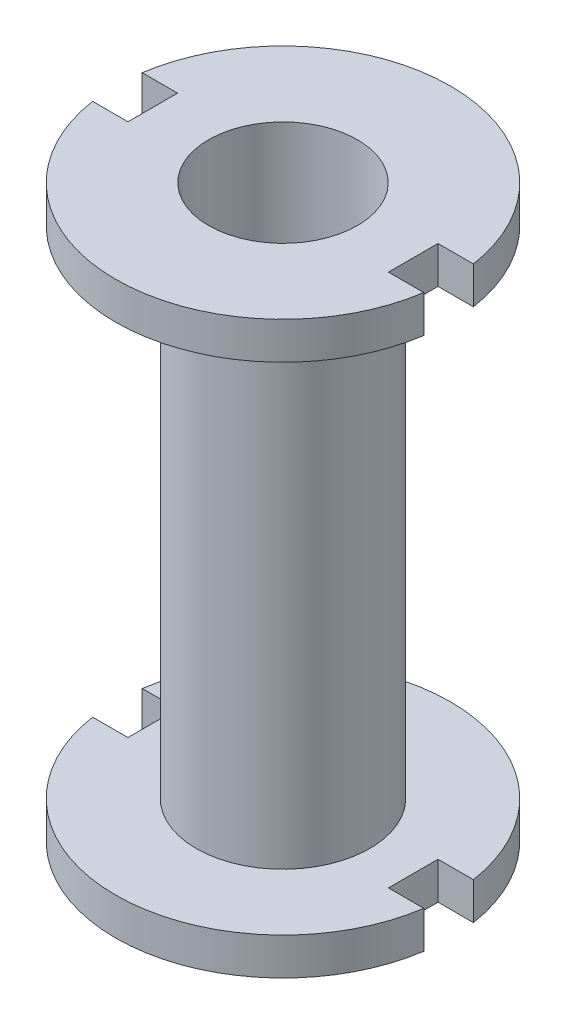
ISO-10303-21;
HEADER;
FILE_DESCRIPTION(('STEP AP214'),'2;1');
FILE_NAME('part.step','',(''),(''),'','','');
FILE_SCHEMA(('AUTOMOTIVE_DESIGN { 1 0 10303 214 1 1 1 1 }'));
ENDSEC;
DATA;
#1=APPLICATION_CONTEXT('core data for automotive mechanical design processes');
#2=APPLICATION_PROTOCOL_DEFINITION('international standard','automotive_design',2000,#1);
#3=PRODUCT_CONTEXT('',#1,'mechanical');
#4=PRODUCT('Part','Part','',(#3));
#5=PRODUCT_RELATED_PRODUCT_CATEGORY('part','',(#4));
#6=PRODUCT_DEFINITION_FORMATION('','',#4);
#7=PRODUCT_DEFINITION_CONTEXT('part definition',#1,'design');
#8=PRODUCT_DEFINITION('design','',#6,#7);
#9=PRODUCT_DEFINITION_SHAPE('','',#8);
#10=(LENGTH_UNIT() NAMED_UNIT(*) SI_UNIT(.MILLI.,.METRE.));
#11=(NAMED_UNIT(*) PLANE_ANGLE_UNIT() SI_UNIT($,.RADIAN.));
#12=(NAMED_UNIT(*) SI_UNIT($,.STERADIAN.) SOLID_ANGLE_UNIT());
#13=UNCERTAINTY_MEASURE_WITH_UNIT(LENGTH_MEASURE(1.E-05),#10,'distance_accuracy_value','');
#14=(GEOMETRIC_REPRESENTATION_CONTEXT(3) GLOBAL_UNCERTAINTY_ASSIGNED_CONTEXT((#13)) GLOBAL_UNIT_ASSIGNED_CONTEXT((#10,
#11,#12)) REPRESENTATION_CONTEXT('',''));
#15=CARTESIAN_POINT('',(0.,0.,0.));
#16=DIRECTION('',(0.,0.,1.));
#17=DIRECTION('',(1.,0.,0.));
#18=AXIS2_PLACEMENT_3D('',#15,#16,#17);
#19=CARTESIAN_POINT('',(0.,11.5,0.));
#20=DIRECTION('',(0.,-1.,0.));
#21=DIRECTION('',(0.,0.,-1.));
#22=AXIS2_PLACEMENT_3D('',#19,#20,#21);
#23=CYLINDRICAL_SURFACE('',#22,6.75);
#24=CARTESIAN_POINT('',(0.,-10.,0.));
#25=DIRECTION('',(0.,1.,0.));
#26=DIRECTION('',(0.,0.,1.));
#27=AXIS2_PLACEMENT_3D('',#24,#25,#26);
#28=CIRCLE('',#27,6.75);
#29=CARTESIAN_POINT('',(-6.67551496140934,-10.,1.));
#30=VERTEX_POINT('',#29);
#31=CARTESIAN_POINT('',(6.67551496140934,-10.,1.));
#32=VERTEX_POINT('',#31);
#33=EDGE_CURVE('E264',#30,#32,#28,.T.);
#34=ORIENTED_EDGE('',*,*,#33,.F.);
#35=DIRECTION('',(0.,-1.,0.));
#36=VECTOR('',#35,1.);
#37=CARTESIAN_POINT('',(-6.67551496140934,11.5,1.));
#38=LINE('',#37,#36);
#39=CARTESIAN_POINT('',(-6.67551496140934,-11.5,1.));
#40=VERTEX_POINT('',#39);
#41=EDGE_CURVE('E235',#30,#40,#38,.T.);
#42=ORIENTED_EDGE('',*,*,#41,.T.);
#43=CARTESIAN_POINT('',(0.,-11.5,0.));
#44=DIRECTION('',(0.,1.,0.));
#45=DIRECTION('',(0.,0.,1.));
#46=AXIS2_PLACEMENT_3D('',#43,#44,#45);
#47=CIRCLE('',#46,6.75);
#48=CARTESIAN_POINT('',(6.67551496140934,-11.5,1.));
#49=VERTEX_POINT('',#48);
#50=EDGE_CURVE('E249',#40,#49,#47,.T.);
#51=ORIENTED_EDGE('',*,*,#50,.T.);
#52=DIRECTION('',(0.,-1.,0.));
#53=VECTOR('',#52,1.);
#54=CARTESIAN_POINT('',(6.67551496140934,11.5,1.));
#55=LINE('',#54,#53);
#56=EDGE_CURVE('E221',#49,#32,#55,.F.);
#57=ORIENTED_EDGE('',*,*,#56,.T.);
#58=EDGE_LOOP('',(#34,#42,#51,#57));
#59=FACE_BOUND('',#58,.T.);
#60=ADVANCED_FACE('F34',(#59),#23,.T.);
#61=CARTESIAN_POINT('',(0.,11.5,0.));
#62=DIRECTION('',(0.,1.,0.));
#63=DIRECTION('',(0.,0.,1.));
#64=AXIS2_PLACEMENT_3D('',#61,#62,#63);
#65=CIRCLE('',#64,6.75);
#66=CARTESIAN_POINT('',(-6.67551496140934,11.5,1.));
#67=VERTEX_POINT('',#66);
#68=CARTESIAN_POINT('',(6.67551496140934,11.5,1.));
#69=VERTEX_POINT('',#68);
#70=EDGE_CURVE('E254',#67,#69,#65,.T.);
#71=ORIENTED_EDGE('',*,*,#70,.F.);
#72=DIRECTION('',(0.,-1.,0.));
#73=VECTOR('',#72,1.);
#74=CARTESIAN_POINT('',(-6.67551496140934,11.5,1.));
#75=LINE('',#74,#73);
#76=CARTESIAN_POINT('',(-6.67551496140934,10.,1.));
#77=VERTEX_POINT('',#76);
#78=EDGE_CURVE('E230',#67,#77,#75,.T.);
#79=ORIENTED_EDGE('',*,*,#78,.T.);
#80=CARTESIAN_POINT('',(0.,10.,0.));
#81=DIRECTION('',(0.,1.,0.));
#82=DIRECTION('',(0.,0.,1.));
#83=AXIS2_PLACEMENT_3D('',#80,#81,#82);
#84=CIRCLE('',#83,6.75);
#85=CARTESIAN_POINT('',(6.67551496140934,10.,1.));
#86=VERTEX_POINT('',#85);
#87=EDGE_CURVE('E243',#77,#86,#84,.T.);
#88=ORIENTED_EDGE('',*,*,#87,.T.);
#89=DIRECTION('',(0.,-1.,0.));
#90=VECTOR('',#89,1.);
#91=CARTESIAN_POINT('',(6.67551496140934,11.5,1.));
#92=LINE('',#91,#90);
#93=EDGE_CURVE('E216',#86,#69,#92,.F.);
#94=ORIENTED_EDGE('',*,*,#93,.T.);
#95=EDGE_LOOP('',(#71,#79,#88,#94));
#96=FACE_BOUND('',#95,.T.);
#97=ADVANCED_FACE('F314',(#96),#23,.T.);
#98=CARTESIAN_POINT('',(6.67551496140934,-11.5,-1.));
#99=VERTEX_POINT('',#98);
#100=CARTESIAN_POINT('',(-6.67551496140934,-11.5,-1.));
#101=VERTEX_POINT('',#100);
#102=EDGE_CURVE('E258',#99,#101,#47,.T.);
#103=ORIENTED_EDGE('',*,*,#102,.T.);
#104=DIRECTION('',(0.,-1.,0.));
#105=VECTOR('',#104,1.);
#106=CARTESIAN_POINT('',(-6.67551496140934,11.5,-1.));
#107=LINE('',#106,#105);
#108=CARTESIAN_POINT('',(-6.67551496140934,-10.,-1.));
#109=VERTEX_POINT('',#108);
#110=EDGE_CURVE('E161',#101,#109,#107,.F.);
#111=ORIENTED_EDGE('',*,*,#110,.T.);
#112=CARTESIAN_POINT('',(6.67551496140934,-10.,-1.));
#113=VERTEX_POINT('',#112);
#114=EDGE_CURVE('E253',#113,#109,#28,.T.);
#115=ORIENTED_EDGE('',*,*,#114,.F.);
#116=DIRECTION('',(0.,-1.,0.));
#117=VECTOR('',#116,1.);
#118=CARTESIAN_POINT('',(6.67551496140934,11.5,-1.));
#119=LINE('',#118,#117);
#120=EDGE_CURVE('E57',#113,#99,#119,.T.);
#121=ORIENTED_EDGE('',*,*,#120,.T.);
#122=EDGE_LOOP('',(#103,#111,#115,#121));
#123=FACE_BOUND('',#122,.T.);
#124=ADVANCED_FACE('F316',(#123),#23,.T.);
#125=CARTESIAN_POINT('',(0.,11.5,0.));
#126=DIRECTION('',(0.,1.,0.));
#127=DIRECTION('',(0.,0.,1.));
#128=AXIS2_PLACEMENT_3D('',#125,#126,#127);
#129=PLANE('',#128);
#130=DIRECTION('',(1.,0.,0.));
#131=VECTOR('',#130,1.);
#132=CARTESIAN_POINT('',(-8.25,11.5,1.));
#133=LINE('',#132,#131);
#134=CARTESIAN_POINT('',(-5.25,11.5,1.));
#135=VERTEX_POINT('',#134);
#136=EDGE_CURVE('E170',#67,#135,#133,.T.);
#137=ORIENTED_EDGE('',*,*,#136,.F.);
#138=ORIENTED_EDGE('',*,*,#70,.T.);
#139=DIRECTION('',(1.,0.,0.));
#140=VECTOR('',#139,1.);
#141=CARTESIAN_POINT('',(5.25,11.5,1.));
#142=LINE('',#141,#140);
#143=CARTESIAN_POINT('',(5.25,11.5,1.));
#144=VERTEX_POINT('',#143);
#145=EDGE_CURVE('E189',#144,#69,#142,.T.);
#146=ORIENTED_EDGE('',*,*,#145,.F.);
#147=DIRECTION('',(0.,0.,1.));
#148=VECTOR('',#147,1.);
#149=CARTESIAN_POINT('',(5.25,11.5,-1.));
#150=LINE('',#149,#148);
#151=CARTESIAN_POINT('',(5.25,11.5,-1.));
#152=VERTEX_POINT('',#151);
#153=EDGE_CURVE('E199',#152,#144,#150,.T.);
#154=ORIENTED_EDGE('',*,*,#153,.F.);
#155=DIRECTION('',(-1.,0.,0.));
#156=VECTOR('',#155,1.);
#157=CARTESIAN_POINT('',(5.25,11.5,-1.));
#158=LINE('',#157,#156);
#159=CARTESIAN_POINT('',(6.67551496140934,11.5,-1.));
#160=VERTEX_POINT('',#159);
#161=EDGE_CURVE('E196',#160,#152,#158,.T.);
#162=ORIENTED_EDGE('',*,*,#161,.F.);
#163=CARTESIAN_POINT('',(-6.67551496140934,11.5,-1.));
#164=VERTEX_POINT('',#163);
#165=EDGE_CURVE('E257',#160,#164,#65,.T.);
#166=ORIENTED_EDGE('',*,*,#165,.T.);
#167=DIRECTION('',(-1.,0.,0.));
#168=VECTOR('',#167,1.);
#169=CARTESIAN_POINT('',(-8.25,11.5,-1.));
#170=LINE('',#169,#168);
#171=CARTESIAN_POINT('',(-5.25,11.5,-1.));
#172=VERTEX_POINT('',#171);
#173=EDGE_CURVE('E173',#172,#164,#170,.T.);
#174=ORIENTED_EDGE('',*,*,#173,.F.);
#175=DIRECTION('',(0.,0.,-1.));
#176=VECTOR('',#175,1.);
#177=CARTESIAN_POINT('',(-5.25,11.5,-1.));
#178=LINE('',#177,#176);
#179=EDGE_CURVE('E177',#135,#172,#178,.T.);
#180=ORIENTED_EDGE('',*,*,#179,.F.);
#181=EDGE_LOOP('',(#137,#138,#146,#154,#162,#166,#174,#180));
#182=FACE_BOUND('',#181,.T.);
#183=CARTESIAN_POINT('',(0.,11.5,0.));
#184=DIRECTION('',(0.,1.,0.));
#185=DIRECTION('',(0.,0.,1.));
#186=AXIS2_PLACEMENT_3D('',#183,#184,#185);
#187=CIRCLE('',#186,3.);
#188=CARTESIAN_POINT('',(0.,11.5,3.));
#189=VERTEX_POINT('',#188);
#190=EDGE_CURVE('E246',#189,#189,#187,.T.);
#191=ORIENTED_EDGE('',*,*,#190,.F.);
#192=EDGE_LOOP('',(#191));
#193=FACE_BOUND('',#192,.T.);
#194=ADVANCED_FACE('F295',(#182,#193),#129,.T.);
#195=CARTESIAN_POINT('',(0.,-11.5,0.));
#196=DIRECTION('',(0.,1.,0.));
#197=DIRECTION('',(0.,0.,1.));
#198=AXIS2_PLACEMENT_3D('',#195,#196,#197);
#199=PLANE('',#198);
#200=ORIENTED_EDGE('',*,*,#50,.F.);
#201=DIRECTION('',(1.,0.,0.));
#202=VECTOR('',#201,1.);
#203=CARTESIAN_POINT('',(-8.25,-11.5,1.));
#204=LINE('',#203,#202);
#205=CARTESIAN_POINT('',(-5.25,-11.5,1.));
#206=VERTEX_POINT('',#205);
#207=EDGE_CURVE('E165',#40,#206,#204,.T.);
#208=ORIENTED_EDGE('',*,*,#207,.T.);
#209=DIRECTION('',(0.,0.,-1.));
#210=VECTOR('',#209,1.);
#211=CARTESIAN_POINT('',(-5.25,-11.5,-1.));
#212=LINE('',#211,#210);
#213=CARTESIAN_POINT('',(-5.25,-11.5,-1.));
#214=VERTEX_POINT('',#213);
#215=EDGE_CURVE('E149',#206,#214,#212,.T.);
#216=ORIENTED_EDGE('',*,*,#215,.T.);
#217=DIRECTION('',(-1.,0.,0.));
#218=VECTOR('',#217,1.);
#219=CARTESIAN_POINT('',(-8.25,-11.5,-1.));
#220=LINE('',#219,#218);
#221=EDGE_CURVE('E158',#214,#101,#220,.T.);
#222=ORIENTED_EDGE('',*,*,#221,.T.);
#223=ORIENTED_EDGE('',*,*,#102,.F.);
#224=DIRECTION('',(-1.,0.,0.));
#225=VECTOR('',#224,1.);
#226=CARTESIAN_POINT('',(5.25,-11.5,-1.));
#227=LINE('',#226,#225);
#228=CARTESIAN_POINT('',(5.25,-11.5,-1.));
#229=VERTEX_POINT('',#228);
#230=EDGE_CURVE('E185',#99,#229,#227,.T.);
#231=ORIENTED_EDGE('',*,*,#230,.T.);
#232=DIRECTION('',(0.,0.,1.));
#233=VECTOR('',#232,1.);
#234=CARTESIAN_POINT('',(5.25,-11.5,-1.));
#235=LINE('',#234,#233);
#236=CARTESIAN_POINT('',(5.25,-11.5,1.));
#237=VERTEX_POINT('',#236);
#238=EDGE_CURVE('E188',#229,#237,#235,.T.);
#239=ORIENTED_EDGE('',*,*,#238,.T.);
#240=DIRECTION('',(1.,0.,0.));
#241=VECTOR('',#240,1.);
#242=CARTESIAN_POINT('',(5.25,-11.5,1.));
#243=LINE('',#242,#241);
#244=EDGE_CURVE('E192',#237,#49,#243,.T.);
#245=ORIENTED_EDGE('',*,*,#244,.T.);
#246=EDGE_LOOP('',(#200,#208,#216,#222,#223,#231,#239,#245));
#247=FACE_BOUND('',#246,.T.);
#248=CARTESIAN_POINT('',(0.,-11.5,0.));
#249=DIRECTION('',(0.,1.,0.));
#250=DIRECTION('',(0.,0.,1.));
#251=AXIS2_PLACEMENT_3D('',#248,#249,#250);
#252=CIRCLE('',#251,3.);
#253=CARTESIAN_POINT('',(0.,-11.5,3.));
#254=VERTEX_POINT('',#253);
#255=EDGE_CURVE('E250',#254,#254,#252,.T.);
#256=ORIENTED_EDGE('',*,*,#255,.T.);
#257=EDGE_LOOP('',(#256));
#258=FACE_BOUND('',#257,.T.);
#259=ADVANCED_FACE('F168',(#247,#258),#199,.F.);
#260=CARTESIAN_POINT('',(6.67551496140934,10.,-1.));
#261=VERTEX_POINT('',#260);
#262=CARTESIAN_POINT('',(-6.67551496140934,10.,-1.));
#263=VERTEX_POINT('',#262);
#264=EDGE_CURVE('E263',#261,#263,#84,.T.);
#265=ORIENTED_EDGE('',*,*,#264,.T.);
#266=DIRECTION('',(0.,-1.,0.));
#267=VECTOR('',#266,1.);
#268=CARTESIAN_POINT('',(-6.67551496140934,11.5,-1.));
#269=LINE('',#268,#267);
#270=EDGE_CURVE('E224',#263,#164,#269,.F.);
#271=ORIENTED_EDGE('',*,*,#270,.T.);
#272=ORIENTED_EDGE('',*,*,#165,.F.);
#273=DIRECTION('',(0.,-1.,0.));
#274=VECTOR('',#273,1.);
#275=CARTESIAN_POINT('',(6.67551496140934,11.5,-1.));
#276=LINE('',#275,#274);
#277=EDGE_CURVE('E183',#160,#261,#276,.T.);
#278=ORIENTED_EDGE('',*,*,#277,.T.);
#279=EDGE_LOOP('',(#265,#271,#272,#278));
#280=FACE_BOUND('',#279,.T.);
#281=ADVANCED_FACE('F36',(#280),#23,.T.);
#282=CARTESIAN_POINT('',(0.,11.5,0.));
#283=DIRECTION('',(0.,-1.,0.));
#284=DIRECTION('',(0.,0.,-1.));
#285=AXIS2_PLACEMENT_3D('',#282,#283,#284);
#286=CYLINDRICAL_SURFACE('',#285,3.);
#287=ORIENTED_EDGE('',*,*,#190,.T.);
#288=EDGE_LOOP('',(#287));
#289=FACE_BOUND('',#288,.T.);
#290=ORIENTED_EDGE('',*,*,#255,.F.);
#291=EDGE_LOOP('',(#290));
#292=FACE_BOUND('',#291,.T.);
#293=ADVANCED_FACE('F327',(#289,#292),#286,.F.);
#294=CARTESIAN_POINT('',(0.,-10.,0.));
#295=DIRECTION('',(0.,1.,0.));
#296=DIRECTION('',(0.,0.,1.));
#297=AXIS2_PLACEMENT_3D('',#294,#295,#296);
#298=PLANE('',#297);
#299=DIRECTION('',(1.,0.,0.));
#300=VECTOR('',#299,1.);
#301=CARTESIAN_POINT('',(0.,-10.,1.));
#302=LINE('',#301,#300);
#303=CARTESIAN_POINT('',(-5.25,-10.,1.));
#304=VERTEX_POINT('',#303);
#305=EDGE_CURVE('E233',#30,#304,#302,.T.);
#306=ORIENTED_EDGE('',*,*,#305,.F.);
#307=ORIENTED_EDGE('',*,*,#33,.T.);
#308=DIRECTION('',(1.,0.,0.));
#309=VECTOR('',#308,1.);
#310=CARTESIAN_POINT('',(0.,-10.,1.));
#311=LINE('',#310,#309);
#312=CARTESIAN_POINT('',(5.25,-10.,1.));
#313=VERTEX_POINT('',#312);
#314=EDGE_CURVE('E219',#313,#32,#311,.T.);
#315=ORIENTED_EDGE('',*,*,#314,.F.);
#316=DIRECTION('',(0.,0.,1.));
#317=VECTOR('',#316,1.);
#318=CARTESIAN_POINT('',(5.25,-10.,0.));
#319=LINE('',#318,#317);
#320=CARTESIAN_POINT('',(5.25,-10.,-1.));
#321=VERTEX_POINT('',#320);
#322=EDGE_CURVE('E214',#321,#313,#319,.T.);
#323=ORIENTED_EDGE('',*,*,#322,.F.);
#324=DIRECTION('',(-1.,0.,0.));
#325=VECTOR('',#324,1.);
#326=CARTESIAN_POINT('',(0.,-10.,-1.));
#327=LINE('',#326,#325);
#328=EDGE_CURVE('E211',#113,#321,#327,.T.);
#329=ORIENTED_EDGE('',*,*,#328,.F.);
#330=ORIENTED_EDGE('',*,*,#114,.T.);
#331=DIRECTION('',(-1.,0.,0.));
#332=VECTOR('',#331,1.);
#333=CARTESIAN_POINT('',(0.,-10.,-1.));
#334=LINE('',#333,#332);
#335=CARTESIAN_POINT('',(-5.25,-10.,-1.));
#336=VERTEX_POINT('',#335);
#337=EDGE_CURVE('E227',#336,#109,#334,.T.);
#338=ORIENTED_EDGE('',*,*,#337,.F.);
#339=DIRECTION('',(0.,0.,-1.));
#340=VECTOR('',#339,1.);
#341=CARTESIAN_POINT('',(-5.25,-10.,0.));
#342=LINE('',#341,#340);
#343=EDGE_CURVE('E152',#304,#336,#342,.T.);
#344=ORIENTED_EDGE('',*,*,#343,.F.);
#345=EDGE_LOOP('',(#306,#307,#315,#323,#329,#330,#338,#344));
#346=FACE_BOUND('',#345,.T.);
#347=CARTESIAN_POINT('',(0.,-10.,0.));
#348=DIRECTION('',(0.,1.,0.));
#349=DIRECTION('',(0.,0.,1.));
#350=AXIS2_PLACEMENT_3D('',#347,#348,#349);
#351=CIRCLE('',#350,3.5);
#352=CARTESIAN_POINT('',(0.,-10.,3.5));
#353=VERTEX_POINT('',#352);
#354=EDGE_CURVE('E240',#353,#353,#351,.T.);
#355=ORIENTED_EDGE('',*,*,#354,.F.);
#356=EDGE_LOOP('',(#355));
#357=FACE_BOUND('',#356,.T.);
#358=ADVANCED_FACE('F332',(#346,#357),#298,.T.);
#359=CARTESIAN_POINT('',(0.,10.,0.));
#360=DIRECTION('',(0.,1.,0.));
#361=DIRECTION('',(0.,0.,1.));
#362=AXIS2_PLACEMENT_3D('',#359,#360,#361);
#363=PLANE('',#362);
#364=CARTESIAN_POINT('',(0.,10.,0.));
#365=DIRECTION('',(0.,1.,0.));
#366=DIRECTION('',(0.,0.,1.));
#367=AXIS2_PLACEMENT_3D('',#364,#365,#366);
#368=CIRCLE('',#367,3.5);
#369=CARTESIAN_POINT('',(0.,10.,3.5));
#370=VERTEX_POINT('',#369);
#371=EDGE_CURVE('E239',#370,#370,#368,.T.);
#372=ORIENTED_EDGE('',*,*,#371,.T.);
#373=EDGE_LOOP('',(#372));
#374=FACE_BOUND('',#373,.T.);
#375=ORIENTED_EDGE('',*,*,#87,.F.);
#376=DIRECTION('',(1.,0.,0.));
#377=VECTOR('',#376,1.);
#378=CARTESIAN_POINT('',(0.,10.,1.));
#379=LINE('',#378,#377);
#380=CARTESIAN_POINT('',(-5.25,10.,1.));
#381=VERTEX_POINT('',#380);
#382=EDGE_CURVE('E11',#77,#381,#379,.T.);
#383=ORIENTED_EDGE('',*,*,#382,.T.);
#384=DIRECTION('',(0.,0.,-1.));
#385=VECTOR('',#384,1.);
#386=CARTESIAN_POINT('',(-5.25,10.,0.));
#387=LINE('',#386,#385);
#388=CARTESIAN_POINT('',(-5.25,10.,-1.));
#389=VERTEX_POINT('',#388);
#390=EDGE_CURVE('E42',#381,#389,#387,.T.);
#391=ORIENTED_EDGE('',*,*,#390,.T.);
#392=DIRECTION('',(-1.,0.,0.));
#393=VECTOR('',#392,1.);
#394=CARTESIAN_POINT('',(0.,10.,-1.));
#395=LINE('',#394,#393);
#396=EDGE_CURVE('E276',#389,#263,#395,.T.);
#397=ORIENTED_EDGE('',*,*,#396,.T.);
#398=ORIENTED_EDGE('',*,*,#264,.F.);
#399=DIRECTION('',(-1.,0.,0.));
#400=VECTOR('',#399,1.);
#401=CARTESIAN_POINT('',(0.,10.,-1.));
#402=LINE('',#401,#400);
#403=CARTESIAN_POINT('',(5.25,10.,-1.));
#404=VERTEX_POINT('',#403);
#405=EDGE_CURVE('E267',#261,#404,#402,.T.);
#406=ORIENTED_EDGE('',*,*,#405,.T.);
#407=DIRECTION('',(0.,0.,1.));
#408=VECTOR('',#407,1.);
#409=CARTESIAN_POINT('',(5.25,10.,0.));
#410=LINE('',#409,#408);
#411=CARTESIAN_POINT('',(5.25,10.,1.));
#412=VERTEX_POINT('',#411);
#413=EDGE_CURVE('E270',#404,#412,#410,.T.);
#414=ORIENTED_EDGE('',*,*,#413,.T.);
#415=DIRECTION('',(1.,0.,0.));
#416=VECTOR('',#415,1.);
#417=CARTESIAN_POINT('',(0.,10.,1.));
#418=LINE('',#417,#416);
#419=EDGE_CURVE('E273',#412,#86,#418,.T.);
#420=ORIENTED_EDGE('',*,*,#419,.T.);
#421=EDGE_LOOP('',(#375,#383,#391,#397,#398,#406,#414,#420));
#422=FACE_BOUND('',#421,.T.);
#423=ADVANCED_FACE('F281',(#374,#422),#363,.F.);
#424=CARTESIAN_POINT('',(0.,-10.,0.));
#425=DIRECTION('',(0.,1.,0.));
#426=DIRECTION('',(0.,0.,1.));
#427=AXIS2_PLACEMENT_3D('',#424,#425,#426);
#428=CYLINDRICAL_SURFACE('',#427,3.5);
#429=ORIENTED_EDGE('',*,*,#354,.T.);
#430=EDGE_LOOP('',(#429));
#431=FACE_BOUND('',#430,.T.);
#432=ORIENTED_EDGE('',*,*,#371,.F.);
#433=EDGE_LOOP('',(#432));
#434=FACE_BOUND('',#433,.T.);
#435=ADVANCED_FACE('F342',(#431,#434),#428,.T.);
#436=CARTESIAN_POINT('',(5.25,-11.5,-1.));
#437=DIRECTION('',(0.,0.,-1.));
#438=DIRECTION('',(-1.,0.,0.));
#439=AXIS2_PLACEMENT_3D('',#436,#437,#438);
#440=PLANE('',#439);
#441=ORIENTED_EDGE('',*,*,#161,.T.);
#442=DIRECTION('',(0.,1.,0.));
#443=VECTOR('',#442,1.);
#444=CARTESIAN_POINT('',(5.25,-11.5,-1.));
#445=LINE('',#444,#443);
#446=EDGE_CURVE('E195',#404,#152,#445,.T.);
#447=ORIENTED_EDGE('',*,*,#446,.F.);
#448=ORIENTED_EDGE('',*,*,#405,.F.);
#449=ORIENTED_EDGE('',*,*,#277,.F.);
#450=EDGE_LOOP('',(#441,#447,#448,#449));
#451=FACE_BOUND('',#450,.T.);
#452=ADVANCED_FACE('F305',(#451),#440,.F.);
#453=CARTESIAN_POINT('',(5.25,-11.5,-1.));
#454=DIRECTION('',(-1.,0.,0.));
#455=DIRECTION('',(0.,0.,1.));
#456=AXIS2_PLACEMENT_3D('',#453,#454,#455);
#457=PLANE('',#456);
#458=ORIENTED_EDGE('',*,*,#446,.T.);
#459=ORIENTED_EDGE('',*,*,#153,.T.);
#460=DIRECTION('',(0.,1.,0.));
#461=VECTOR('',#460,1.);
#462=CARTESIAN_POINT('',(5.25,-11.5,1.));
#463=LINE('',#462,#461);
#464=EDGE_CURVE('E205',#412,#144,#463,.T.);
#465=ORIENTED_EDGE('',*,*,#464,.F.);
#466=ORIENTED_EDGE('',*,*,#413,.F.);
#467=EDGE_LOOP('',(#458,#459,#465,#466));
#468=FACE_BOUND('',#467,.T.);
#469=ADVANCED_FACE('F309',(#468),#457,.F.);
#470=CARTESIAN_POINT('',(5.25,-11.5,1.));
#471=DIRECTION('',(0.,0.,1.));
#472=DIRECTION('',(1.,0.,0.));
#473=AXIS2_PLACEMENT_3D('',#470,#471,#472);
#474=PLANE('',#473);
#475=ORIENTED_EDGE('',*,*,#419,.F.);
#476=ORIENTED_EDGE('',*,*,#464,.T.);
#477=ORIENTED_EDGE('',*,*,#145,.T.);
#478=ORIENTED_EDGE('',*,*,#93,.F.);
#479=EDGE_LOOP('',(#475,#476,#477,#478));
#480=FACE_BOUND('',#479,.T.);
#481=ADVANCED_FACE('F312',(#480),#474,.F.);
#482=CARTESIAN_POINT('',(-8.25,-11.5,-1.));
#483=DIRECTION('',(0.,0.,-1.));
#484=DIRECTION('',(-1.,0.,0.));
#485=AXIS2_PLACEMENT_3D('',#482,#483,#484);
#486=PLANE('',#485);
#487=ORIENTED_EDGE('',*,*,#396,.F.);
#488=DIRECTION('',(0.,1.,0.));
#489=VECTOR('',#488,1.);
#490=CARTESIAN_POINT('',(-5.25,-11.5,-1.));
#491=LINE('',#490,#489);
#492=EDGE_CURVE('E155',#389,#172,#491,.T.);
#493=ORIENTED_EDGE('',*,*,#492,.T.);
#494=ORIENTED_EDGE('',*,*,#173,.T.);
#495=ORIENTED_EDGE('',*,*,#270,.F.);
#496=EDGE_LOOP('',(#487,#493,#494,#495));
#497=FACE_BOUND('',#496,.T.);
#498=ADVANCED_FACE('F301',(#497),#486,.F.);
#499=CARTESIAN_POINT('',(-8.25,-11.5,1.));
#500=DIRECTION('',(0.,0.,1.));
#501=DIRECTION('',(1.,0.,0.));
#502=AXIS2_PLACEMENT_3D('',#499,#500,#501);
#503=PLANE('',#502);
#504=ORIENTED_EDGE('',*,*,#136,.T.);
#505=DIRECTION('',(0.,1.,0.));
#506=VECTOR('',#505,1.);
#507=CARTESIAN_POINT('',(-5.25,-11.5,1.));
#508=LINE('',#507,#506);
#509=EDGE_CURVE('E154',#381,#135,#508,.T.);
#510=ORIENTED_EDGE('',*,*,#509,.F.);
#511=ORIENTED_EDGE('',*,*,#382,.F.);
#512=ORIENTED_EDGE('',*,*,#78,.F.);
#513=EDGE_LOOP('',(#504,#510,#511,#512));
#514=FACE_BOUND('',#513,.T.);
#515=ADVANCED_FACE('F289',(#514),#503,.F.);
#516=CARTESIAN_POINT('',(-5.25,-11.5,-1.));
#517=DIRECTION('',(1.,0.,0.));
#518=DIRECTION('',(0.,0.,-1.));
#519=AXIS2_PLACEMENT_3D('',#516,#517,#518);
#520=PLANE('',#519);
#521=ORIENTED_EDGE('',*,*,#509,.T.);
#522=ORIENTED_EDGE('',*,*,#179,.T.);
#523=ORIENTED_EDGE('',*,*,#492,.F.);
#524=ORIENTED_EDGE('',*,*,#390,.F.);
#525=EDGE_LOOP('',(#521,#522,#523,#524));
#526=FACE_BOUND('',#525,.T.);
#527=ADVANCED_FACE('F287',(#526),#520,.F.);
#528=ORIENTED_EDGE('',*,*,#244,.F.);
#529=EDGE_CURVE('E180',#237,#313,#463,.T.);
#530=ORIENTED_EDGE('',*,*,#529,.T.);
#531=ORIENTED_EDGE('',*,*,#314,.T.);
#532=ORIENTED_EDGE('',*,*,#56,.F.);
#533=EDGE_LOOP('',(#528,#530,#531,#532));
#534=FACE_BOUND('',#533,.T.);
#535=ADVANCED_FACE('F354',(#534),#474,.F.);
#536=ORIENTED_EDGE('',*,*,#328,.T.);
#537=EDGE_CURVE('E206',#229,#321,#445,.T.);
#538=ORIENTED_EDGE('',*,*,#537,.F.);
#539=ORIENTED_EDGE('',*,*,#230,.F.);
#540=ORIENTED_EDGE('',*,*,#120,.F.);
#541=EDGE_LOOP('',(#536,#538,#539,#540));
#542=FACE_BOUND('',#541,.T.);
#543=ADVANCED_FACE('F350',(#542),#440,.F.);
#544=ORIENTED_EDGE('',*,*,#322,.T.);
#545=ORIENTED_EDGE('',*,*,#529,.F.);
#546=ORIENTED_EDGE('',*,*,#238,.F.);
#547=ORIENTED_EDGE('',*,*,#537,.T.);
#548=EDGE_LOOP('',(#544,#545,#546,#547));
#549=FACE_BOUND('',#548,.T.);
#550=ADVANCED_FACE('F353',(#549),#457,.F.);
#551=ORIENTED_EDGE('',*,*,#305,.T.);
#552=EDGE_CURVE('E182',#206,#304,#508,.T.);
#553=ORIENTED_EDGE('',*,*,#552,.F.);
#554=ORIENTED_EDGE('',*,*,#207,.F.);
#555=ORIENTED_EDGE('',*,*,#41,.F.);
#556=EDGE_LOOP('',(#551,#553,#554,#555));
#557=FACE_BOUND('',#556,.T.);
#558=ADVANCED_FACE('F357',(#557),#503,.F.);
#559=ORIENTED_EDGE('',*,*,#221,.F.);
#560=EDGE_CURVE('E49',#214,#336,#491,.T.);
#561=ORIENTED_EDGE('',*,*,#560,.T.);
#562=ORIENTED_EDGE('',*,*,#337,.T.);
#563=ORIENTED_EDGE('',*,*,#110,.F.);
#564=EDGE_LOOP('',(#559,#561,#562,#563));
#565=FACE_BOUND('',#564,.T.);
#566=ADVANCED_FACE('F159',(#565),#486,.F.);
#567=ORIENTED_EDGE('',*,*,#343,.T.);
#568=ORIENTED_EDGE('',*,*,#560,.F.);
#569=ORIENTED_EDGE('',*,*,#215,.F.);
#570=ORIENTED_EDGE('',*,*,#552,.T.);
#571=EDGE_LOOP('',(#567,#568,#569,#570));
#572=FACE_BOUND('',#571,.T.);
#573=ADVANCED_FACE('F146',(#572),#520,.F.);
#574=CLOSED_SHELL('',(#60,#97,#124,#194,#259,#281,#293,#358,#423,#435,#452,#469,#481,#498,#515,
#527,#535,#543,#550,#558,#566,#573));
#575=MANIFOLD_SOLID_BREP('B2',#574);
#576=ADVANCED_BREP_SHAPE_REPRESENTATION('',(#18,#575),#14);
#577=SHAPE_DEFINITION_REPRESENTATION(#9,#576);
ENDSEC;
END-ISO-10303-21;
